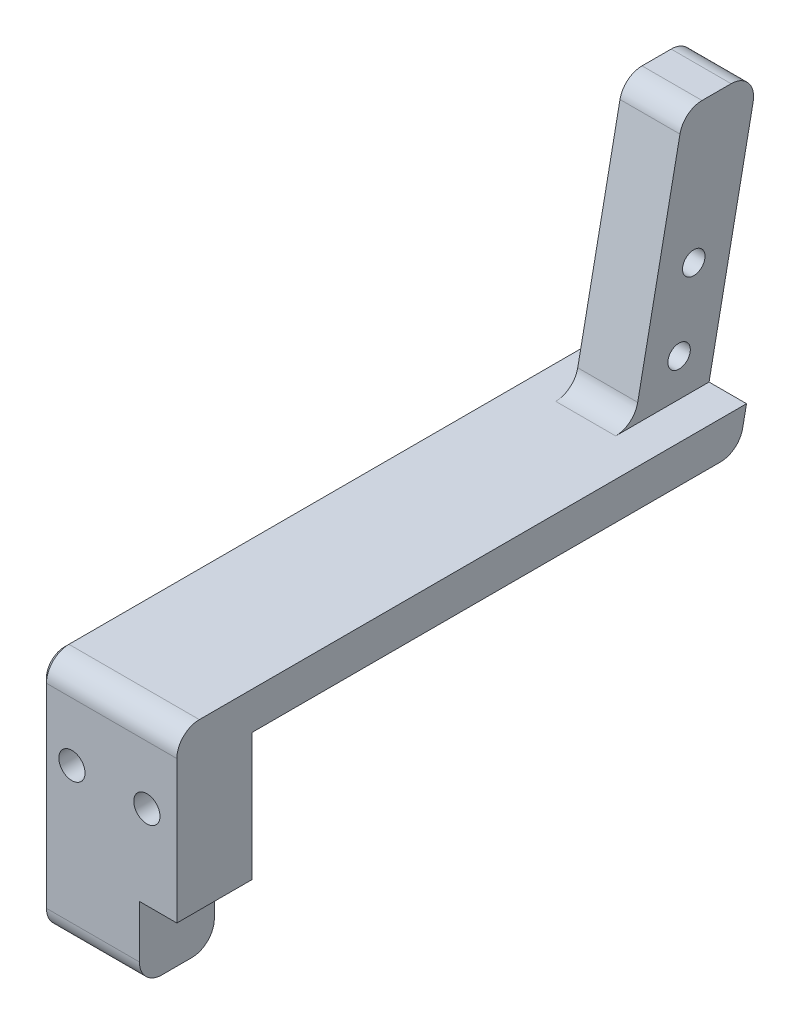
ISO-10303-21;
HEADER;
FILE_DESCRIPTION(('STEP AP214'),'2;1');
FILE_NAME('part.step','',(''),(''),'','','');
FILE_SCHEMA(('AUTOMOTIVE_DESIGN { 1 0 10303 214 1 1 1 1 }'));
ENDSEC;
DATA;
#1=APPLICATION_CONTEXT('core data for automotive mechanical design processes');
#2=APPLICATION_PROTOCOL_DEFINITION('international standard','automotive_design',2000,#1);
#3=PRODUCT_CONTEXT('',#1,'mechanical');
#4=PRODUCT('Part','Part','',(#3));
#5=PRODUCT_RELATED_PRODUCT_CATEGORY('part','',(#4));
#6=PRODUCT_DEFINITION_FORMATION('','',#4);
#7=PRODUCT_DEFINITION_CONTEXT('part definition',#1,'design');
#8=PRODUCT_DEFINITION('design','',#6,#7);
#9=PRODUCT_DEFINITION_SHAPE('','',#8);
#10=(LENGTH_UNIT() NAMED_UNIT(*) SI_UNIT(.MILLI.,.METRE.));
#11=(NAMED_UNIT(*) PLANE_ANGLE_UNIT() SI_UNIT($,.RADIAN.));
#12=(NAMED_UNIT(*) SI_UNIT($,.STERADIAN.) SOLID_ANGLE_UNIT());
#13=UNCERTAINTY_MEASURE_WITH_UNIT(LENGTH_MEASURE(1.E-05),#10,'distance_accuracy_value','');
#14=(GEOMETRIC_REPRESENTATION_CONTEXT(3) GLOBAL_UNCERTAINTY_ASSIGNED_CONTEXT((#13)) GLOBAL_UNIT_ASSIGNED_CONTEXT((#10,
#11,#12)) REPRESENTATION_CONTEXT('',''));
#15=CARTESIAN_POINT('',(0.,0.,0.));
#16=DIRECTION('',(0.,0.,1.));
#17=DIRECTION('',(1.,0.,0.));
#18=AXIS2_PLACEMENT_3D('',#15,#16,#17);
#19=CARTESIAN_POINT('',(-99.9217668900714,-11.3731402474737,-56.8653527400471));
#20=DIRECTION('',(0.,-0.196117290802064,-0.980580444557436));
#21=DIRECTION('',(0.,0.980580444557436,-0.196117290802064));
#22=AXIS2_PLACEMENT_3D('',#19,#20,#21);
#23=PLANE('',#22);
#24=DIRECTION('',(0.,-0.980580444557436,0.196117290802064));
#25=VECTOR('',#24,1.);
#26=CARTESIAN_POINT('',(4.,-11.3731402474737,-56.8653527400471));
#27=LINE('',#26,#25);
#28=CARTESIAN_POINT('',(4.,39.8883518724062,-67.1177139948746));
#29=VERTEX_POINT('',#28);
#30=CARTESIAN_POINT('',(4.,11.7116481275938,-61.4823387099239));
#31=VERTEX_POINT('',#30);
#32=EDGE_CURVE('E445',#29,#31,#27,.T.);
#33=ORIENTED_EDGE('',*,*,#32,.F.);
#34=DIRECTION('',(1.,0.,0.));
#35=VECTOR('',#34,1.);
#36=CARTESIAN_POINT('',(-99.9217668900714,39.8883518724062,-67.1177139948746));
#37=LINE('',#36,#35);
#38=CARTESIAN_POINT('',(-4.,39.8883518724062,-67.1177139948746));
#39=VERTEX_POINT('',#38);
#40=EDGE_CURVE('E318',#29,#39,#37,.F.);
#41=ORIENTED_EDGE('',*,*,#40,.T.);
#42=DIRECTION('',(0.,-0.980580444557436,0.196117290802064));
#43=VECTOR('',#42,1.);
#44=CARTESIAN_POINT('',(-4.,-11.3731402474737,-56.8653527400471));
#45=LINE('',#44,#43);
#46=CARTESIAN_POINT('',(-4.,11.7116481275938,-61.4823387099239));
#47=VERTEX_POINT('',#46);
#48=EDGE_CURVE('E454',#39,#47,#45,.T.);
#49=ORIENTED_EDGE('',*,*,#48,.T.);
#50=DIRECTION('',(1.,0.,0.));
#51=VECTOR('',#50,1.);
#52=CARTESIAN_POINT('',(4.,11.7116481275938,-61.4823387099239));
#53=LINE('',#52,#51);
#54=EDGE_CURVE('E314',#47,#31,#53,.T.);
#55=ORIENTED_EDGE('',*,*,#54,.T.);
#56=EDGE_LOOP('',(#33,#41,#49,#55));
#57=FACE_BOUND('',#56,.T.);
#58=ADVANCED_FACE('F43',(#57),#23,.F.);
#59=CARTESIAN_POINT('',(-99.9217668900714,42.2999999999999,0.));
#60=DIRECTION('',(0.,-1.,0.));
#61=DIRECTION('',(0.,0.,-1.));
#62=AXIS2_PLACEMENT_3D('',#59,#60,#61);
#63=PLANE('',#62);
#64=DIRECTION('',(0.,0.,-1.));
#65=VECTOR('',#64,1.);
#66=CARTESIAN_POINT('',(4.,42.2999999999999,0.));
#67=LINE('',#66,#65);
#68=CARTESIAN_POINT('',(4.,42.2999999999999,-70.0594553285469));
#69=VERTEX_POINT('',#68);
#70=CARTESIAN_POINT('',(4.,42.2999999999999,-73.9406304699623));
#71=VERTEX_POINT('',#70);
#72=EDGE_CURVE('E232',#69,#71,#67,.T.);
#73=ORIENTED_EDGE('',*,*,#72,.T.);
#74=DIRECTION('',(1.,0.,0.));
#75=VECTOR('',#74,1.);
#76=CARTESIAN_POINT('',(-99.9217668900714,42.3,-73.9406304699623));
#77=LINE('',#76,#75);
#78=CARTESIAN_POINT('',(-4.,42.2999999999999,-73.9406304699623));
#79=VERTEX_POINT('',#78);
#80=EDGE_CURVE('E305',#71,#79,#77,.F.);
#81=ORIENTED_EDGE('',*,*,#80,.T.);
#82=DIRECTION('',(0.,0.,-1.));
#83=VECTOR('',#82,1.);
#84=CARTESIAN_POINT('',(-4.,42.2999999999999,0.));
#85=LINE('',#84,#83);
#86=CARTESIAN_POINT('',(-4.,42.2999999999999,-70.0594553285469));
#87=VERTEX_POINT('',#86);
#88=EDGE_CURVE('E441',#87,#79,#85,.T.);
#89=ORIENTED_EDGE('',*,*,#88,.F.);
#90=DIRECTION('',(1.,0.,0.));
#91=VECTOR('',#90,1.);
#92=CARTESIAN_POINT('',(-99.9217668900714,42.3,-70.0594553285469));
#93=LINE('',#92,#91);
#94=EDGE_CURVE('E301',#87,#69,#93,.T.);
#95=ORIENTED_EDGE('',*,*,#94,.T.);
#96=EDGE_LOOP('',(#73,#81,#89,#95));
#97=FACE_BOUND('',#96,.T.);
#98=ADVANCED_FACE('F605',(#97),#63,.F.);
#99=CARTESIAN_POINT('',(-99.9217668900714,-13.2962280494745,-66.4807328225317));
#100=DIRECTION('',(0.,0.196117290802064,0.980580444557436));
#101=DIRECTION('',(0.,-0.980580444557436,0.196117290802064));
#102=AXIS2_PLACEMENT_3D('',#99,#100,#101);
#103=PLANE('',#102);
#104=DIRECTION('',(1.,0.,0.));
#105=VECTOR('',#104,1.);
#106=CARTESIAN_POINT('',(-99.9217668900714,6.7116481275938,-70.4823325814589));
#107=LINE('',#106,#105);
#108=CARTESIAN_POINT('',(9.,6.7116481275938,-70.4823325814589));
#109=VERTEX_POINT('',#108);
#110=CARTESIAN_POINT('',(-8.39999999999999,6.7116481275938,-70.4823325814589));
#111=VERTEX_POINT('',#110);
#112=EDGE_CURVE('E292',#109,#111,#107,.F.);
#113=ORIENTED_EDGE('',*,*,#112,.T.);
#114=DIRECTION('',(0.,0.980580444557436,-0.196117290802064));
#115=VECTOR('',#114,1.);
#116=CARTESIAN_POINT('',(-8.39999999999999,-13.2962280494745,-66.4807328225317));
#117=LINE('',#116,#115);
#118=CARTESIAN_POINT('',(-8.39999999999999,9.3,-71.0000061284649));
#119=VERTEX_POINT('',#118);
#120=EDGE_CURVE('E376',#111,#119,#117,.T.);
#121=ORIENTED_EDGE('',*,*,#120,.T.);
#122=DIRECTION('',(1.,0.,0.));
#123=VECTOR('',#122,1.);
#124=CARTESIAN_POINT('',(-99.9217668900714,9.3,-71.0000061284649));
#125=LINE('',#124,#123);
#126=CARTESIAN_POINT('',(-4.,9.3,-71.0000061284649));
#127=VERTEX_POINT('',#126);
#128=EDGE_CURVE('E241',#119,#127,#125,.T.);
#129=ORIENTED_EDGE('',*,*,#128,.T.);
#130=DIRECTION('',(0.,0.980580444557436,-0.196117290802064));
#131=VECTOR('',#130,1.);
#132=CARTESIAN_POINT('',(-4.,-13.2962280494745,-66.4807328225317));
#133=LINE('',#132,#131);
#134=CARTESIAN_POINT('',(-4.,38.7116481275938,-76.8823718036346));
#135=VERTEX_POINT('',#134);
#136=EDGE_CURVE('E244',#127,#135,#133,.T.);
#137=ORIENTED_EDGE('',*,*,#136,.T.);
#138=DIRECTION('',(1.,0.,0.));
#139=VECTOR('',#138,1.);
#140=CARTESIAN_POINT('',(-99.9217668900714,38.7116481275938,-76.8823718036346));
#141=LINE('',#140,#139);
#142=CARTESIAN_POINT('',(4.,38.7116481275938,-76.8823718036346));
#143=VERTEX_POINT('',#142);
#144=EDGE_CURVE('E239',#135,#143,#141,.T.);
#145=ORIENTED_EDGE('',*,*,#144,.T.);
#146=DIRECTION('',(0.,0.980580444557436,-0.196117290802064));
#147=VECTOR('',#146,1.);
#148=CARTESIAN_POINT('',(4.,-13.2962280494745,-66.4807328225317));
#149=LINE('',#148,#147);
#150=CARTESIAN_POINT('',(4.,9.3,-71.0000061284649));
#151=VERTEX_POINT('',#150);
#152=EDGE_CURVE('E221',#151,#143,#149,.T.);
#153=ORIENTED_EDGE('',*,*,#152,.F.);
#154=DIRECTION('',(1.,0.,0.));
#155=VECTOR('',#154,1.);
#156=CARTESIAN_POINT('',(-99.9217668900714,9.3,-71.0000061284649));
#157=LINE('',#156,#155);
#158=CARTESIAN_POINT('',(9.,9.3,-71.0000061284649));
#159=VERTEX_POINT('',#158);
#160=EDGE_CURVE('E207',#151,#159,#157,.T.);
#161=ORIENTED_EDGE('',*,*,#160,.T.);
#162=DIRECTION('',(0.,-0.980580444557436,0.196117290802064));
#163=VECTOR('',#162,1.);
#164=CARTESIAN_POINT('',(9.,-13.2962280494745,-66.4807328225317));
#165=LINE('',#164,#163);
#166=EDGE_CURVE('E464',#159,#109,#165,.T.);
#167=ORIENTED_EDGE('',*,*,#166,.T.);
#168=EDGE_LOOP('',(#113,#121,#129,#137,#145,#153,#161,#167));
#169=FACE_BOUND('',#168,.T.);
#170=ADVANCED_FACE('F236',(#169),#103,.F.);
#171=CARTESIAN_POINT('',(9.,0.,-5.));
#172=DIRECTION('',(0.,0.,1.));
#173=DIRECTION('',(1.,0.,0.));
#174=AXIS2_PLACEMENT_3D('',#171,#172,#173);
#175=PLANE('',#174);
#176=CARTESIAN_POINT('',(-5.,-1.5,-5.));
#177=DIRECTION('',(0.,0.,-1.));
#178=DIRECTION('',(-1.,0.,0.));
#179=AXIS2_PLACEMENT_3D('',#176,#177,#178);
#180=CIRCLE('',#179,1.75);
#181=CARTESIAN_POINT('',(-6.75,-1.5,-5.));
#182=VERTEX_POINT('',#181);
#183=EDGE_CURVE('E498',#182,#182,#180,.T.);
#184=ORIENTED_EDGE('',*,*,#183,.F.);
#185=EDGE_LOOP('',(#184));
#186=FACE_BOUND('',#185,.T.);
#187=CARTESIAN_POINT('',(5.,-1.5,-5.));
#188=DIRECTION('',(0.,0.,-1.));
#189=DIRECTION('',(-1.,0.,0.));
#190=AXIS2_PLACEMENT_3D('',#187,#188,#189);
#191=CIRCLE('',#190,1.75);
#192=CARTESIAN_POINT('',(3.25,-1.5,-5.));
#193=VERTEX_POINT('',#192);
#194=EDGE_CURVE('E492',#193,#193,#191,.F.);
#195=ORIENTED_EDGE('',*,*,#194,.T.);
#196=EDGE_LOOP('',(#195));
#197=FACE_BOUND('',#196,.T.);
#198=DIRECTION('',(1.,0.,0.));
#199=VECTOR('',#198,1.);
#200=CARTESIAN_POINT('',(9.,-19.7,-5.));
#201=LINE('',#200,#199);
#202=CARTESIAN_POINT('',(4.,-19.7,-5.));
#203=VERTEX_POINT('',#202);
#204=CARTESIAN_POINT('',(-8.4,-19.7,-5.));
#205=VERTEX_POINT('',#204);
#206=EDGE_CURVE('E277',#203,#205,#201,.F.);
#207=ORIENTED_EDGE('',*,*,#206,.T.);
#208=DIRECTION('',(0.,1.,0.));
#209=VECTOR('',#208,1.);
#210=CARTESIAN_POINT('',(-8.4,0.,-5.));
#211=LINE('',#210,#209);
#212=CARTESIAN_POINT('',(-8.40000000000002,4.3,-5.));
#213=VERTEX_POINT('',#212);
#214=EDGE_CURVE('E367',#205,#213,#211,.T.);
#215=ORIENTED_EDGE('',*,*,#214,.T.);
#216=DIRECTION('',(1.,0.,0.));
#217=VECTOR('',#216,1.);
#218=CARTESIAN_POINT('',(-99.9217668900714,4.3,-5.));
#219=LINE('',#218,#217);
#220=CARTESIAN_POINT('',(9.,4.3,-5.));
#221=VERTEX_POINT('',#220);
#222=EDGE_CURVE('E467',#213,#221,#219,.T.);
#223=ORIENTED_EDGE('',*,*,#222,.T.);
#224=DIRECTION('',(0.,1.,0.));
#225=VECTOR('',#224,1.);
#226=CARTESIAN_POINT('',(9.,0.,-5.));
#227=LINE('',#226,#225);
#228=CARTESIAN_POINT('',(9.,-12.7,-5.));
#229=VERTEX_POINT('',#228);
#230=EDGE_CURVE('E512',#229,#221,#227,.T.);
#231=ORIENTED_EDGE('',*,*,#230,.F.);
#232=DIRECTION('',(-1.,0.,0.));
#233=VECTOR('',#232,1.);
#234=CARTESIAN_POINT('',(9.00000000000001,-12.7,-5.));
#235=LINE('',#234,#233);
#236=CARTESIAN_POINT('',(4.,-12.7,-5.));
#237=VERTEX_POINT('',#236);
#238=EDGE_CURVE('E488',#229,#237,#235,.T.);
#239=ORIENTED_EDGE('',*,*,#238,.T.);
#240=DIRECTION('',(0.,-1.,0.));
#241=VECTOR('',#240,1.);
#242=CARTESIAN_POINT('',(4.,0.,-5.));
#243=LINE('',#242,#241);
#244=EDGE_CURVE('E482',#237,#203,#243,.T.);
#245=ORIENTED_EDGE('',*,*,#244,.T.);
#246=EDGE_LOOP('',(#207,#215,#223,#231,#239,#245));
#247=FACE_BOUND('',#246,.T.);
#248=ADVANCED_FACE('F573',(#186,#197,#247),#175,.F.);
#249=CARTESIAN_POINT('',(9.,0.,5.));
#250=DIRECTION('',(0.,0.,1.));
#251=DIRECTION('',(1.,0.,0.));
#252=AXIS2_PLACEMENT_3D('',#249,#250,#251);
#253=PLANE('',#252);
#254=DIRECTION('',(1.,0.,0.));
#255=VECTOR('',#254,1.);
#256=CARTESIAN_POINT('',(-8.99999999999999,6.3,5.));
#257=LINE('',#256,#255);
#258=CARTESIAN_POINT('',(9.,6.3,5.));
#259=VERTEX_POINT('',#258);
#260=CARTESIAN_POINT('',(-8.4,6.3,5.));
#261=VERTEX_POINT('',#260);
#262=EDGE_CURVE('E265',#259,#261,#257,.F.);
#263=ORIENTED_EDGE('',*,*,#262,.T.);
#264=DIRECTION('',(0.,-1.,0.));
#265=VECTOR('',#264,1.);
#266=CARTESIAN_POINT('',(-8.4,-19.7,5.));
#267=LINE('',#266,#265);
#268=CARTESIAN_POINT('',(-8.4,-19.7,5.));
#269=VERTEX_POINT('',#268);
#270=EDGE_CURVE('E69',#261,#269,#267,.T.);
#271=ORIENTED_EDGE('',*,*,#270,.T.);
#272=DIRECTION('',(-1.,0.,0.));
#273=VECTOR('',#272,1.);
#274=CARTESIAN_POINT('',(4.,-19.7,5.));
#275=LINE('',#274,#273);
#276=CARTESIAN_POINT('',(4.,-19.7,5.));
#277=VERTEX_POINT('',#276);
#278=EDGE_CURVE('E268',#269,#277,#275,.F.);
#279=ORIENTED_EDGE('',*,*,#278,.T.);
#280=DIRECTION('',(0.,-1.,0.));
#281=VECTOR('',#280,1.);
#282=CARTESIAN_POINT('',(4.,-22.7,5.));
#283=LINE('',#282,#281);
#284=CARTESIAN_POINT('',(4.,-12.7,5.));
#285=VERTEX_POINT('',#284);
#286=EDGE_CURVE('E474',#285,#277,#283,.T.);
#287=ORIENTED_EDGE('',*,*,#286,.F.);
#288=DIRECTION('',(-1.,0.,0.));
#289=VECTOR('',#288,1.);
#290=CARTESIAN_POINT('',(9.,-12.7,5.));
#291=LINE('',#290,#289);
#292=CARTESIAN_POINT('',(9.,-12.7,5.));
#293=VERTEX_POINT('',#292);
#294=EDGE_CURVE('E470',#293,#285,#291,.T.);
#295=ORIENTED_EDGE('',*,*,#294,.F.);
#296=DIRECTION('',(0.,1.,0.));
#297=VECTOR('',#296,1.);
#298=CARTESIAN_POINT('',(9.,0.,5.));
#299=LINE('',#298,#297);
#300=EDGE_CURVE('E497',#293,#259,#299,.T.);
#301=ORIENTED_EDGE('',*,*,#300,.T.);
#302=EDGE_LOOP('',(#263,#271,#279,#287,#295,#301));
#303=FACE_BOUND('',#302,.T.);
#304=CARTESIAN_POINT('',(5.,-1.5,5.));
#305=DIRECTION('',(0.,0.,-1.));
#306=DIRECTION('',(-1.,0.,0.));
#307=AXIS2_PLACEMENT_3D('',#304,#305,#306);
#308=CIRCLE('',#307,1.75);
#309=CARTESIAN_POINT('',(3.25,-1.5,5.));
#310=VERTEX_POINT('',#309);
#311=EDGE_CURVE('E502',#310,#310,#308,.F.);
#312=ORIENTED_EDGE('',*,*,#311,.F.);
#313=EDGE_LOOP('',(#312));
#314=FACE_BOUND('',#313,.T.);
#315=CARTESIAN_POINT('',(-5.,-1.5,5.));
#316=DIRECTION('',(0.,0.,-1.));
#317=DIRECTION('',(-1.,0.,0.));
#318=AXIS2_PLACEMENT_3D('',#315,#316,#317);
#319=CIRCLE('',#318,1.75);
#320=CARTESIAN_POINT('',(-6.75,-1.5,5.));
#321=VERTEX_POINT('',#320);
#322=EDGE_CURVE('E493',#321,#321,#319,.T.);
#323=ORIENTED_EDGE('',*,*,#322,.T.);
#324=EDGE_LOOP('',(#323));
#325=FACE_BOUND('',#324,.T.);
#326=ADVANCED_FACE('F531',(#303,#314,#325),#253,.T.);
#327=CARTESIAN_POINT('',(-9.,0.,0.));
#328=DIRECTION('',(1.,0.,0.));
#329=DIRECTION('',(0.,0.,-1.));
#330=AXIS2_PLACEMENT_3D('',#327,#328,#329);
#331=PLANE('',#330);
#332=DIRECTION('',(0.,-1.,0.));
#333=VECTOR('',#332,1.);
#334=CARTESIAN_POINT('',(-9.,0.,-4.4));
#335=LINE('',#334,#333);
#336=CARTESIAN_POINT('',(-9.,4.9,-4.4));
#337=VERTEX_POINT('',#336);
#338=CARTESIAN_POINT('',(-9.,-19.7,-4.4));
#339=VERTEX_POINT('',#338);
#340=EDGE_CURVE('E356',#337,#339,#335,.T.);
#341=ORIENTED_EDGE('',*,*,#340,.T.);
#342=CARTESIAN_POINT('',(-9.,-19.7,-2.));
#343=DIRECTION('',(1.,0.,0.));
#344=DIRECTION('',(0.,0.,-1.));
#345=AXIS2_PLACEMENT_3D('',#342,#343,#344);
#346=CIRCLE('',#345,2.4);
#347=CARTESIAN_POINT('',(-9.,-22.1,-2.));
#348=VERTEX_POINT('',#347);
#349=EDGE_CURVE('E359',#339,#348,#346,.F.);
#350=ORIENTED_EDGE('',*,*,#349,.T.);
#351=DIRECTION('',(0.,0.,1.));
#352=VECTOR('',#351,1.);
#353=CARTESIAN_POINT('',(-9.,-22.1,0.));
#354=LINE('',#353,#352);
#355=CARTESIAN_POINT('',(-9.,-22.1,2.));
#356=VERTEX_POINT('',#355);
#357=EDGE_CURVE('E332',#348,#356,#354,.T.);
#358=ORIENTED_EDGE('',*,*,#357,.T.);
#359=CARTESIAN_POINT('',(-9.,-19.7,2.));
#360=DIRECTION('',(1.,0.,0.));
#361=DIRECTION('',(0.,0.,-1.));
#362=AXIS2_PLACEMENT_3D('',#359,#360,#361);
#363=CIRCLE('',#362,2.4);
#364=CARTESIAN_POINT('',(-9.,-19.7,4.4));
#365=VERTEX_POINT('',#364);
#366=EDGE_CURVE('E335',#356,#365,#363,.F.);
#367=ORIENTED_EDGE('',*,*,#366,.T.);
#368=DIRECTION('',(0.,1.,0.));
#369=VECTOR('',#368,1.);
#370=CARTESIAN_POINT('',(-9.,6.3,4.4));
#371=LINE('',#370,#369);
#372=CARTESIAN_POINT('',(-9.,6.3,4.4));
#373=VERTEX_POINT('',#372);
#374=EDGE_CURVE('E338',#365,#373,#371,.T.);
#375=ORIENTED_EDGE('',*,*,#374,.T.);
#376=CARTESIAN_POINT('',(-9.,6.3,2.));
#377=DIRECTION('',(1.,0.,0.));
#378=DIRECTION('',(0.,0.,-1.));
#379=AXIS2_PLACEMENT_3D('',#376,#377,#378);
#380=CIRCLE('',#379,2.39999999999999);
#381=CARTESIAN_POINT('',(-9.,8.69999999999999,2.));
#382=VERTEX_POINT('',#381);
#383=EDGE_CURVE('E341',#373,#382,#380,.F.);
#384=ORIENTED_EDGE('',*,*,#383,.T.);
#385=DIRECTION('',(0.,0.,-1.));
#386=VECTOR('',#385,1.);
#387=CARTESIAN_POINT('',(-9.,8.7,0.));
#388=LINE('',#387,#386);
#389=CARTESIAN_POINT('',(-9.,8.7,-70.2681229071907));
#390=VERTEX_POINT('',#389);
#391=EDGE_CURVE('E344',#382,#390,#388,.T.);
#392=ORIENTED_EDGE('',*,*,#391,.T.);
#393=DIRECTION('',(0.,-0.980580444557436,0.196117290802064));
#394=VECTOR('',#393,1.);
#395=CARTESIAN_POINT('',(-9.,-13.1785576749933,-65.8923845557972));
#396=LINE('',#395,#394);
#397=CARTESIAN_POINT('',(-9.,6.82931850207504,-69.8939843147245));
#398=VERTEX_POINT('',#397);
#399=EDGE_CURVE('E347',#390,#398,#396,.T.);
#400=ORIENTED_EDGE('',*,*,#399,.T.);
#401=CARTESIAN_POINT('',(-9.,7.3,-67.5405912477866));
#402=DIRECTION('',(1.,0.,0.));
#403=DIRECTION('',(0.,0.,-1.));
#404=AXIS2_PLACEMENT_3D('',#401,#402,#403);
#405=CIRCLE('',#404,2.39999999999999);
#406=CARTESIAN_POINT('',(-9.,4.90000000000001,-67.5405912477866));
#407=VERTEX_POINT('',#406);
#408=EDGE_CURVE('E350',#398,#407,#405,.F.);
#409=ORIENTED_EDGE('',*,*,#408,.T.);
#410=DIRECTION('',(0.,0.,1.));
#411=VECTOR('',#410,1.);
#412=CARTESIAN_POINT('',(-9.,4.9,0.));
#413=LINE('',#412,#411);
#414=EDGE_CURVE('E353',#407,#337,#413,.T.);
#415=ORIENTED_EDGE('',*,*,#414,.T.);
#416=EDGE_LOOP('',(#341,#350,#358,#367,#375,#384,#392,#400,#409,#415));
#417=FACE_BOUND('',#416,.T.);
#418=ADVANCED_FACE('F593',(#417),#331,.F.);
#419=CARTESIAN_POINT('',(9.,0.,0.));
#420=DIRECTION('',(1.,0.,0.));
#421=DIRECTION('',(0.,0.,-1.));
#422=AXIS2_PLACEMENT_3D('',#419,#420,#421);
#423=PLANE('',#422);
#424=DIRECTION('',(0.,0.,1.));
#425=VECTOR('',#424,1.);
#426=CARTESIAN_POINT('',(9.,4.29999999999999,0.));
#427=LINE('',#426,#425);
#428=CARTESIAN_POINT('',(9.,4.3,-67.5405912477866));
#429=VERTEX_POINT('',#428);
#430=EDGE_CURVE('E460',#429,#221,#427,.T.);
#431=ORIENTED_EDGE('',*,*,#430,.F.);
#432=CARTESIAN_POINT('',(8.99999999999999,7.3,-67.5405912477866));
#433=DIRECTION('',(1.,0.,0.));
#434=DIRECTION('',(0.,0.,-1.));
#435=AXIS2_PLACEMENT_3D('',#432,#433,#434);
#436=CIRCLE('',#435,3.);
#437=EDGE_CURVE('E287',#429,#109,#436,.T.);
#438=ORIENTED_EDGE('',*,*,#437,.T.);
#439=ORIENTED_EDGE('',*,*,#166,.F.);
#440=DIRECTION('',(0.,0.,-1.));
#441=VECTOR('',#440,1.);
#442=CARTESIAN_POINT('',(9.,9.3,0.));
#443=LINE('',#442,#441);
#444=CARTESIAN_POINT('',(9.,9.3,2.));
#445=VERTEX_POINT('',#444);
#446=EDGE_CURVE('E215',#445,#159,#443,.T.);
#447=ORIENTED_EDGE('',*,*,#446,.F.);
#448=CARTESIAN_POINT('',(8.99999999999999,6.3,2.));
#449=DIRECTION('',(1.,0.,0.));
#450=DIRECTION('',(0.,0.,-1.));
#451=AXIS2_PLACEMENT_3D('',#448,#449,#450);
#452=CIRCLE('',#451,3.);
#453=EDGE_CURVE('E284',#445,#259,#452,.T.);
#454=ORIENTED_EDGE('',*,*,#453,.T.);
#455=ORIENTED_EDGE('',*,*,#300,.F.);
#456=DIRECTION('',(0.,0.,1.));
#457=VECTOR('',#456,1.);
#458=CARTESIAN_POINT('',(9.,-12.7,-12.1590237649112));
#459=LINE('',#458,#457);
#460=EDGE_CURVE('E478',#229,#293,#459,.T.);
#461=ORIENTED_EDGE('',*,*,#460,.F.);
#462=ORIENTED_EDGE('',*,*,#230,.T.);
#463=EDGE_LOOP('',(#431,#438,#439,#447,#454,#455,#461,#462));
#464=FACE_BOUND('',#463,.T.);
#465=ADVANCED_FACE('F539',(#464),#423,.T.);
#466=CARTESIAN_POINT('',(5.,-1.5,5.));
#467=DIRECTION('',(0.,0.,-1.));
#468=DIRECTION('',(-1.,0.,0.));
#469=AXIS2_PLACEMENT_3D('',#466,#467,#468);
#470=CYLINDRICAL_SURFACE('',#469,1.75);
#471=ORIENTED_EDGE('',*,*,#311,.T.);
#472=EDGE_LOOP('',(#471));
#473=FACE_BOUND('',#472,.T.);
#474=ORIENTED_EDGE('',*,*,#194,.F.);
#475=EDGE_LOOP('',(#474));
#476=FACE_BOUND('',#475,.T.);
#477=ADVANCED_FACE('F656',(#473,#476),#470,.F.);
#478=CARTESIAN_POINT('',(-5.,-1.5,5.));
#479=DIRECTION('',(0.,0.,-1.));
#480=DIRECTION('',(-1.,0.,0.));
#481=AXIS2_PLACEMENT_3D('',#478,#479,#480);
#482=CYLINDRICAL_SURFACE('',#481,1.75);
#483=ORIENTED_EDGE('',*,*,#322,.F.);
#484=EDGE_LOOP('',(#483));
#485=FACE_BOUND('',#484,.T.);
#486=ORIENTED_EDGE('',*,*,#183,.T.);
#487=EDGE_LOOP('',(#486));
#488=FACE_BOUND('',#487,.T.);
#489=ADVANCED_FACE('F653',(#485,#488),#482,.F.);
#490=CARTESIAN_POINT('',(0.,-22.7,0.));
#491=DIRECTION('',(0.,1.,0.));
#492=DIRECTION('',(0.,0.,1.));
#493=AXIS2_PLACEMENT_3D('',#490,#491,#492);
#494=PLANE('',#493);
#495=DIRECTION('',(-1.,0.,0.));
#496=VECTOR('',#495,1.);
#497=CARTESIAN_POINT('',(-9.,-22.7,2.));
#498=LINE('',#497,#496);
#499=CARTESIAN_POINT('',(4.,-22.7,2.));
#500=VERTEX_POINT('',#499);
#501=CARTESIAN_POINT('',(-8.4,-22.7,2.));
#502=VERTEX_POINT('',#501);
#503=EDGE_CURVE('E262',#500,#502,#498,.T.);
#504=ORIENTED_EDGE('',*,*,#503,.T.);
#505=DIRECTION('',(0.,0.,-1.));
#506=VECTOR('',#505,1.);
#507=CARTESIAN_POINT('',(-8.4,-22.7,0.));
#508=LINE('',#507,#506);
#509=CARTESIAN_POINT('',(-8.4,-22.7,-2.));
#510=VERTEX_POINT('',#509);
#511=EDGE_CURVE('E11',#502,#510,#508,.T.);
#512=ORIENTED_EDGE('',*,*,#511,.T.);
#513=DIRECTION('',(1.,0.,0.));
#514=VECTOR('',#513,1.);
#515=CARTESIAN_POINT('',(0.,-22.7,-2.));
#516=LINE('',#515,#514);
#517=CARTESIAN_POINT('',(4.,-22.7,-2.));
#518=VERTEX_POINT('',#517);
#519=EDGE_CURVE('E250',#510,#518,#516,.T.);
#520=ORIENTED_EDGE('',*,*,#519,.T.);
#521=DIRECTION('',(0.,0.,1.));
#522=VECTOR('',#521,1.);
#523=CARTESIAN_POINT('',(4.,-22.7,0.));
#524=LINE('',#523,#522);
#525=EDGE_CURVE('E222',#518,#500,#524,.T.);
#526=ORIENTED_EDGE('',*,*,#525,.T.);
#527=EDGE_LOOP('',(#504,#512,#520,#526));
#528=FACE_BOUND('',#527,.T.);
#529=ADVANCED_FACE('F519',(#528),#494,.F.);
#530=CARTESIAN_POINT('',(9.,-12.7,-12.1590237649112));
#531=DIRECTION('',(0.,1.,0.));
#532=DIRECTION('',(-1.,0.,0.));
#533=AXIS2_PLACEMENT_3D('',#530,#531,#532);
#534=PLANE('',#533);
#535=ORIENTED_EDGE('',*,*,#460,.T.);
#536=ORIENTED_EDGE('',*,*,#294,.T.);
#537=DIRECTION('',(0.,0.,1.));
#538=VECTOR('',#537,1.);
#539=CARTESIAN_POINT('',(4.,-12.7,-12.1590237649112));
#540=LINE('',#539,#538);
#541=EDGE_CURVE('E479',#237,#285,#540,.T.);
#542=ORIENTED_EDGE('',*,*,#541,.F.);
#543=ORIENTED_EDGE('',*,*,#238,.F.);
#544=EDGE_LOOP('',(#535,#536,#542,#543));
#545=FACE_BOUND('',#544,.T.);
#546=ADVANCED_FACE('F648',(#545),#534,.F.);
#547=CARTESIAN_POINT('',(4.,-22.7,-12.1590237649112));
#548=DIRECTION('',(-1.,0.,0.));
#549=DIRECTION('',(0.,0.,1.));
#550=AXIS2_PLACEMENT_3D('',#547,#548,#549);
#551=PLANE('',#550);
#552=ORIENTED_EDGE('',*,*,#286,.T.);
#553=CARTESIAN_POINT('',(4.,-19.7,2.));
#554=DIRECTION('',(-1.,0.,0.));
#555=DIRECTION('',(0.,0.,1.));
#556=AXIS2_PLACEMENT_3D('',#553,#554,#555);
#557=CIRCLE('',#556,3.);
#558=EDGE_CURVE('E274',#277,#500,#557,.F.);
#559=ORIENTED_EDGE('',*,*,#558,.T.);
#560=ORIENTED_EDGE('',*,*,#525,.F.);
#561=CARTESIAN_POINT('',(4.,-19.7,-2.));
#562=DIRECTION('',(-1.,0.,0.));
#563=DIRECTION('',(0.,0.,1.));
#564=AXIS2_PLACEMENT_3D('',#561,#562,#563);
#565=CIRCLE('',#564,3.);
#566=EDGE_CURVE('E271',#518,#203,#565,.F.);
#567=ORIENTED_EDGE('',*,*,#566,.T.);
#568=ORIENTED_EDGE('',*,*,#244,.F.);
#569=ORIENTED_EDGE('',*,*,#541,.T.);
#570=EDGE_LOOP('',(#552,#559,#560,#567,#568,#569));
#571=FACE_BOUND('',#570,.T.);
#572=ADVANCED_FACE('F527',(#571),#551,.F.);
#573=CARTESIAN_POINT('',(-99.9217668900714,9.3,0.));
#574=DIRECTION('',(0.,-1.,0.));
#575=DIRECTION('',(0.,0.,-1.));
#576=AXIS2_PLACEMENT_3D('',#573,#574,#575);
#577=PLANE('',#576);
#578=ORIENTED_EDGE('',*,*,#128,.F.);
#579=DIRECTION('',(0.,0.,1.));
#580=VECTOR('',#579,1.);
#581=CARTESIAN_POINT('',(-8.39999999999999,9.3,0.));
#582=LINE('',#581,#580);
#583=CARTESIAN_POINT('',(-8.39999999999999,9.3,2.));
#584=VERTEX_POINT('',#583);
#585=EDGE_CURVE('E379',#119,#584,#582,.T.);
#586=ORIENTED_EDGE('',*,*,#585,.T.);
#587=DIRECTION('',(1.,0.,0.));
#588=VECTOR('',#587,1.);
#589=CARTESIAN_POINT('',(8.99999999999999,9.3,2.));
#590=LINE('',#589,#588);
#591=EDGE_CURVE('E321',#584,#445,#590,.T.);
#592=ORIENTED_EDGE('',*,*,#591,.T.);
#593=ORIENTED_EDGE('',*,*,#446,.T.);
#594=ORIENTED_EDGE('',*,*,#160,.F.);
#595=DIRECTION('',(0.,0.,-1.));
#596=VECTOR('',#595,1.);
#597=CARTESIAN_POINT('',(4.,9.3,0.));
#598=LINE('',#597,#596);
#599=CARTESIAN_POINT('',(4.,9.3,-58.5405973762516));
#600=VERTEX_POINT('',#599);
#601=EDGE_CURVE('E212',#600,#151,#598,.T.);
#602=ORIENTED_EDGE('',*,*,#601,.F.);
#603=DIRECTION('',(1.,0.,0.));
#604=VECTOR('',#603,1.);
#605=CARTESIAN_POINT('',(-4.,9.3,-58.5405973762516));
#606=LINE('',#605,#604);
#607=CARTESIAN_POINT('',(-4.,9.3,-58.5405973762516));
#608=VERTEX_POINT('',#607);
#609=EDGE_CURVE('E324',#600,#608,#606,.F.);
#610=ORIENTED_EDGE('',*,*,#609,.T.);
#611=DIRECTION('',(0.,0.,-1.));
#612=VECTOR('',#611,1.);
#613=CARTESIAN_POINT('',(-4.,9.3,0.));
#614=LINE('',#613,#612);
#615=EDGE_CURVE('E231',#608,#127,#614,.T.);
#616=ORIENTED_EDGE('',*,*,#615,.T.);
#617=EDGE_LOOP('',(#578,#586,#592,#593,#594,#602,#610,#616));
#618=FACE_BOUND('',#617,.T.);
#619=ADVANCED_FACE('F210',(#618),#577,.F.);
#620=CARTESIAN_POINT('',(-99.9217668900714,4.29999999999999,0.));
#621=DIRECTION('',(0.,1.,0.));
#622=DIRECTION('',(0.,0.,1.));
#623=AXIS2_PLACEMENT_3D('',#620,#621,#622);
#624=PLANE('',#623);
#625=ORIENTED_EDGE('',*,*,#222,.F.);
#626=DIRECTION('',(0.,0.,-1.));
#627=VECTOR('',#626,1.);
#628=CARTESIAN_POINT('',(-8.39999999999999,4.29999999999999,0.));
#629=LINE('',#628,#627);
#630=CARTESIAN_POINT('',(-8.39999999999999,4.3,-67.5405912477866));
#631=VERTEX_POINT('',#630);
#632=EDGE_CURVE('E370',#213,#631,#629,.T.);
#633=ORIENTED_EDGE('',*,*,#632,.T.);
#634=DIRECTION('',(1.,0.,0.));
#635=VECTOR('',#634,1.);
#636=CARTESIAN_POINT('',(-99.9217668900714,4.3,-67.5405912477866));
#637=LINE('',#636,#635);
#638=EDGE_CURVE('E281',#631,#429,#637,.T.);
#639=ORIENTED_EDGE('',*,*,#638,.T.);
#640=ORIENTED_EDGE('',*,*,#430,.T.);
#641=EDGE_LOOP('',(#625,#633,#639,#640));
#642=FACE_BOUND('',#641,.T.);
#643=ADVANCED_FACE('F576',(#642),#624,.F.);
#644=CARTESIAN_POINT('',(4.,-9.96036096916027,0.));
#645=DIRECTION('',(1.,0.,0.));
#646=DIRECTION('',(0.,0.,-1.));
#647=AXIS2_PLACEMENT_3D('',#644,#645,#646);
#648=PLANE('',#647);
#649=CARTESIAN_POINT('',(4.,24.1058044455744,-68.9611851649505));
#650=DIRECTION('',(1.,0.,0.));
#651=DIRECTION('',(0.,0.,-1.));
#652=AXIS2_PLACEMENT_3D('',#649,#650,#651);
#653=CIRCLE('',#652,1.5);
#654=CARTESIAN_POINT('',(4.,24.1058044455744,-70.4611851649505));
#655=VERTEX_POINT('',#654);
#656=EDGE_CURVE('E256',#655,#655,#653,.T.);
#657=ORIENTED_EDGE('',*,*,#656,.F.);
#658=EDGE_LOOP('',(#657));
#659=FACE_BOUND('',#658,.T.);
#660=CARTESIAN_POINT('',(4.,14.3,-67.0000122569299));
#661=DIRECTION('',(1.,0.,0.));
#662=DIRECTION('',(0.,0.,-1.));
#663=AXIS2_PLACEMENT_3D('',#660,#661,#662);
#664=CIRCLE('',#663,1.5);
#665=CARTESIAN_POINT('',(4.,14.3,-68.5000122569299));
#666=VERTEX_POINT('',#665);
#667=EDGE_CURVE('E427',#666,#666,#664,.T.);
#668=ORIENTED_EDGE('',*,*,#667,.F.);
#669=EDGE_LOOP('',(#668));
#670=FACE_BOUND('',#669,.T.);
#671=ORIENTED_EDGE('',*,*,#152,.T.);
#672=CARTESIAN_POINT('',(4.,39.3,-73.9406304699623));
#673=DIRECTION('',(1.,0.,0.));
#674=DIRECTION('',(0.,0.,-1.));
#675=AXIS2_PLACEMENT_3D('',#672,#673,#674);
#676=CIRCLE('',#675,3.);
#677=EDGE_CURVE('E298',#143,#71,#676,.T.);
#678=ORIENTED_EDGE('',*,*,#677,.T.);
#679=ORIENTED_EDGE('',*,*,#72,.F.);
#680=CARTESIAN_POINT('',(4.,39.3,-70.0594553285469));
#681=DIRECTION('',(1.,0.,0.));
#682=DIRECTION('',(0.,0.,-1.));
#683=AXIS2_PLACEMENT_3D('',#680,#681,#682);
#684=CIRCLE('',#683,3.);
#685=EDGE_CURVE('E295',#69,#29,#684,.T.);
#686=ORIENTED_EDGE('',*,*,#685,.T.);
#687=ORIENTED_EDGE('',*,*,#32,.T.);
#688=CARTESIAN_POINT('',(4.,12.3,-58.5405973762516));
#689=DIRECTION('',(1.,0.,0.));
#690=DIRECTION('',(0.,0.,-1.));
#691=AXIS2_PLACEMENT_3D('',#688,#689,#690);
#692=CIRCLE('',#691,3.);
#693=EDGE_CURVE('E228',#31,#600,#692,.F.);
#694=ORIENTED_EDGE('',*,*,#693,.T.);
#695=ORIENTED_EDGE('',*,*,#601,.T.);
#696=EDGE_LOOP('',(#671,#678,#679,#686,#687,#694,#695));
#697=FACE_BOUND('',#696,.T.);
#698=ADVANCED_FACE('F226',(#659,#670,#697),#648,.T.);
#699=CARTESIAN_POINT('',(-4.,-9.96036096916027,0.));
#700=DIRECTION('',(1.,0.,0.));
#701=DIRECTION('',(0.,0.,-1.));
#702=AXIS2_PLACEMENT_3D('',#699,#700,#701);
#703=PLANE('',#702);
#704=CARTESIAN_POINT('',(-4.,24.1058044455744,-68.9611851649505));
#705=DIRECTION('',(1.,0.,0.));
#706=DIRECTION('',(0.,0.,-1.));
#707=AXIS2_PLACEMENT_3D('',#704,#705,#706);
#708=CIRCLE('',#707,1.5);
#709=CARTESIAN_POINT('',(-4.,24.1058044455744,-70.4611851649505));
#710=VERTEX_POINT('',#709);
#711=EDGE_CURVE('E255',#710,#710,#708,.T.);
#712=ORIENTED_EDGE('',*,*,#711,.T.);
#713=EDGE_LOOP('',(#712));
#714=FACE_BOUND('',#713,.T.);
#715=CARTESIAN_POINT('',(-4.,14.3,-67.0000122569299));
#716=DIRECTION('',(1.,0.,0.));
#717=DIRECTION('',(0.,0.,-1.));
#718=AXIS2_PLACEMENT_3D('',#715,#716,#717);
#719=CIRCLE('',#718,1.5);
#720=CARTESIAN_POINT('',(-4.,14.3,-68.5000122569299));
#721=VERTEX_POINT('',#720);
#722=EDGE_CURVE('E251',#721,#721,#719,.T.);
#723=ORIENTED_EDGE('',*,*,#722,.T.);
#724=EDGE_LOOP('',(#723));
#725=FACE_BOUND('',#724,.T.);
#726=ORIENTED_EDGE('',*,*,#88,.T.);
#727=CARTESIAN_POINT('',(-4.,39.3,-73.9406304699623));
#728=DIRECTION('',(1.,0.,0.));
#729=DIRECTION('',(0.,0.,-1.));
#730=AXIS2_PLACEMENT_3D('',#727,#728,#729);
#731=CIRCLE('',#730,3.);
#732=EDGE_CURVE('E311',#79,#135,#731,.F.);
#733=ORIENTED_EDGE('',*,*,#732,.T.);
#734=ORIENTED_EDGE('',*,*,#136,.F.);
#735=ORIENTED_EDGE('',*,*,#615,.F.);
#736=CARTESIAN_POINT('',(-4.,12.3,-58.5405973762516));
#737=DIRECTION('',(1.,0.,0.));
#738=DIRECTION('',(0.,0.,-1.));
#739=AXIS2_PLACEMENT_3D('',#736,#737,#738);
#740=CIRCLE('',#739,3.);
#741=EDGE_CURVE('E329',#608,#47,#740,.T.);
#742=ORIENTED_EDGE('',*,*,#741,.T.);
#743=ORIENTED_EDGE('',*,*,#48,.F.);
#744=CARTESIAN_POINT('',(-4.,39.3,-70.0594553285469));
#745=DIRECTION('',(1.,0.,0.));
#746=DIRECTION('',(0.,0.,-1.));
#747=AXIS2_PLACEMENT_3D('',#744,#745,#746);
#748=CIRCLE('',#747,3.);
#749=EDGE_CURVE('E308',#39,#87,#748,.F.);
#750=ORIENTED_EDGE('',*,*,#749,.T.);
#751=EDGE_LOOP('',(#726,#733,#734,#735,#742,#743,#750));
#752=FACE_BOUND('',#751,.T.);
#753=ADVANCED_FACE('F619',(#714,#725,#752),#703,.F.);
#754=CARTESIAN_POINT('',(-9.00000000000002,14.3,-67.0000122569299));
#755=DIRECTION('',(1.,0.,0.));
#756=DIRECTION('',(0.,0.,-1.));
#757=AXIS2_PLACEMENT_3D('',#754,#755,#756);
#758=CYLINDRICAL_SURFACE('',#757,1.5);
#759=ORIENTED_EDGE('',*,*,#667,.T.);
#760=EDGE_LOOP('',(#759));
#761=FACE_BOUND('',#760,.T.);
#762=ORIENTED_EDGE('',*,*,#722,.F.);
#763=EDGE_LOOP('',(#762));
#764=FACE_BOUND('',#763,.T.);
#765=ADVANCED_FACE('F621',(#761,#764),#758,.F.);
#766=CARTESIAN_POINT('',(-9.00000000000002,24.1058044455744,-68.9611851649505));
#767=DIRECTION('',(1.,0.,0.));
#768=DIRECTION('',(0.,0.,-1.));
#769=AXIS2_PLACEMENT_3D('',#766,#767,#768);
#770=CYLINDRICAL_SURFACE('',#769,1.5);
#771=ORIENTED_EDGE('',*,*,#656,.T.);
#772=EDGE_LOOP('',(#771));
#773=FACE_BOUND('',#772,.T.);
#774=ORIENTED_EDGE('',*,*,#711,.F.);
#775=EDGE_LOOP('',(#774));
#776=FACE_BOUND('',#775,.T.);
#777=ADVANCED_FACE('F628',(#773,#776),#770,.F.);
#778=CARTESIAN_POINT('',(0.,-19.7,2.));
#779=DIRECTION('',(1.,0.,0.));
#780=DIRECTION('',(0.,0.,-1.));
#781=AXIS2_PLACEMENT_3D('',#778,#779,#780);
#782=CYLINDRICAL_SURFACE('',#781,3.);
#783=ORIENTED_EDGE('',*,*,#278,.F.);
#784=CARTESIAN_POINT('',(-8.4,-19.7,2.));
#785=DIRECTION('',(1.,0.,0.));
#786=DIRECTION('',(0.,0.,-1.));
#787=AXIS2_PLACEMENT_3D('',#784,#785,#786);
#788=CIRCLE('',#787,3.);
#789=EDGE_CURVE('E54',#269,#502,#788,.T.);
#790=ORIENTED_EDGE('',*,*,#789,.T.);
#791=ORIENTED_EDGE('',*,*,#503,.F.);
#792=ORIENTED_EDGE('',*,*,#558,.F.);
#793=EDGE_LOOP('',(#783,#790,#791,#792));
#794=FACE_BOUND('',#793,.T.);
#795=ADVANCED_FACE('F525',(#794),#782,.T.);
#796=CARTESIAN_POINT('',(0.,-19.7,-2.));
#797=DIRECTION('',(1.,0.,0.));
#798=DIRECTION('',(0.,0.,-1.));
#799=AXIS2_PLACEMENT_3D('',#796,#797,#798);
#800=CYLINDRICAL_SURFACE('',#799,3.);
#801=ORIENTED_EDGE('',*,*,#519,.F.);
#802=CARTESIAN_POINT('',(-8.4,-19.7,-2.));
#803=DIRECTION('',(1.,0.,0.));
#804=DIRECTION('',(0.,0.,-1.));
#805=AXIS2_PLACEMENT_3D('',#802,#803,#804);
#806=CIRCLE('',#805,3.);
#807=EDGE_CURVE('E363',#510,#205,#806,.T.);
#808=ORIENTED_EDGE('',*,*,#807,.T.);
#809=ORIENTED_EDGE('',*,*,#206,.F.);
#810=ORIENTED_EDGE('',*,*,#566,.F.);
#811=EDGE_LOOP('',(#801,#808,#809,#810));
#812=FACE_BOUND('',#811,.T.);
#813=ADVANCED_FACE('F560',(#812),#800,.T.);
#814=CARTESIAN_POINT('',(-99.9217668900714,7.3,-67.5405912477866));
#815=DIRECTION('',(1.,0.,0.));
#816=DIRECTION('',(0.,0.,-1.));
#817=AXIS2_PLACEMENT_3D('',#814,#815,#816);
#818=CYLINDRICAL_SURFACE('',#817,3.);
#819=ORIENTED_EDGE('',*,*,#638,.F.);
#820=CARTESIAN_POINT('',(-8.39999999999999,7.3,-67.5405912477866));
#821=DIRECTION('',(1.,0.,0.));
#822=DIRECTION('',(0.,0.,-1.));
#823=AXIS2_PLACEMENT_3D('',#820,#821,#822);
#824=CIRCLE('',#823,3.);
#825=EDGE_CURVE('E373',#631,#111,#824,.T.);
#826=ORIENTED_EDGE('',*,*,#825,.T.);
#827=ORIENTED_EDGE('',*,*,#112,.F.);
#828=ORIENTED_EDGE('',*,*,#437,.F.);
#829=EDGE_LOOP('',(#819,#826,#827,#828));
#830=FACE_BOUND('',#829,.T.);
#831=ADVANCED_FACE('F589',(#830),#818,.T.);
#832=CARTESIAN_POINT('',(-99.9217668900714,39.3,-73.9406304699623));
#833=DIRECTION('',(1.,0.,0.));
#834=DIRECTION('',(0.,0.,-1.));
#835=AXIS2_PLACEMENT_3D('',#832,#833,#834);
#836=CYLINDRICAL_SURFACE('',#835,3.);
#837=ORIENTED_EDGE('',*,*,#732,.F.);
#838=ORIENTED_EDGE('',*,*,#80,.F.);
#839=ORIENTED_EDGE('',*,*,#677,.F.);
#840=ORIENTED_EDGE('',*,*,#144,.F.);
#841=EDGE_LOOP('',(#837,#838,#839,#840));
#842=FACE_BOUND('',#841,.T.);
#843=ADVANCED_FACE('F601',(#842),#836,.T.);
#844=CARTESIAN_POINT('',(-99.9217668900714,39.3,-70.0594553285469));
#845=DIRECTION('',(1.,0.,0.));
#846=DIRECTION('',(0.,0.,-1.));
#847=AXIS2_PLACEMENT_3D('',#844,#845,#846);
#848=CYLINDRICAL_SURFACE('',#847,3.);
#849=ORIENTED_EDGE('',*,*,#749,.F.);
#850=ORIENTED_EDGE('',*,*,#40,.F.);
#851=ORIENTED_EDGE('',*,*,#685,.F.);
#852=ORIENTED_EDGE('',*,*,#94,.F.);
#853=EDGE_LOOP('',(#849,#850,#851,#852));
#854=FACE_BOUND('',#853,.T.);
#855=ADVANCED_FACE('F610',(#854),#848,.T.);
#856=CARTESIAN_POINT('',(-99.9217668900714,12.3,-58.5405973762516));
#857=DIRECTION('',(-1.,0.,0.));
#858=DIRECTION('',(0.,0.,1.));
#859=AXIS2_PLACEMENT_3D('',#856,#857,#858);
#860=CYLINDRICAL_SURFACE('',#859,3.);
#861=ORIENTED_EDGE('',*,*,#741,.F.);
#862=ORIENTED_EDGE('',*,*,#609,.F.);
#863=ORIENTED_EDGE('',*,*,#693,.F.);
#864=ORIENTED_EDGE('',*,*,#54,.F.);
#865=EDGE_LOOP('',(#861,#862,#863,#864));
#866=FACE_BOUND('',#865,.T.);
#867=ADVANCED_FACE('F618',(#866),#860,.F.);
#868=CARTESIAN_POINT('',(-99.9217668900714,6.3,2.));
#869=DIRECTION('',(-1.,0.,0.));
#870=DIRECTION('',(0.,0.,1.));
#871=AXIS2_PLACEMENT_3D('',#868,#869,#870);
#872=CYLINDRICAL_SURFACE('',#871,3.);
#873=ORIENTED_EDGE('',*,*,#591,.F.);
#874=CARTESIAN_POINT('',(-8.39999999999999,6.3,2.));
#875=DIRECTION('',(1.,0.,0.));
#876=DIRECTION('',(0.,0.,-1.));
#877=AXIS2_PLACEMENT_3D('',#874,#875,#876);
#878=CIRCLE('',#877,3.);
#879=EDGE_CURVE('E382',#584,#261,#878,.T.);
#880=ORIENTED_EDGE('',*,*,#879,.T.);
#881=ORIENTED_EDGE('',*,*,#262,.F.);
#882=ORIENTED_EDGE('',*,*,#453,.F.);
#883=EDGE_LOOP('',(#873,#880,#881,#882));
#884=FACE_BOUND('',#883,.T.);
#885=ADVANCED_FACE('F544',(#884),#872,.T.);
#886=CARTESIAN_POINT('',(-8.39999999999999,9.3,0.));
#887=DIRECTION('',(0.707106781186544,-0.707106781186551,0.));
#888=DIRECTION('',(0.,0.,1.));
#889=AXIS2_PLACEMENT_3D('',#886,#887,#888);
#890=PLANE('',#889);
#891=DIRECTION('',(-0.707106781186551,-0.707106781186544,0.));
#892=VECTOR('',#891,1.);
#893=CARTESIAN_POINT('',(-8.39999999999999,9.3,2.));
#894=LINE('',#893,#892);
#895=EDGE_CURVE('E418',#584,#382,#894,.T.);
#896=ORIENTED_EDGE('',*,*,#895,.F.);
#897=ORIENTED_EDGE('',*,*,#585,.F.);
#898=DIRECTION('',(-0.535446917225346,-0.535446917225341,0.65314102433376));
#899=VECTOR('',#898,1.);
#900=CARTESIAN_POINT('',(-33.2302888507582,-15.530288850758,-40.711886479693));
#901=LINE('',#900,#899);
#902=EDGE_CURVE('E48',#390,#119,#901,.F.);
#903=ORIENTED_EDGE('',*,*,#902,.F.);
#904=ORIENTED_EDGE('',*,*,#391,.F.);
#905=EDGE_LOOP('',(#896,#897,#903,#904));
#906=FACE_BOUND('',#905,.T.);
#907=ADVANCED_FACE('F46',(#906),#890,.F.);
#908=CARTESIAN_POINT('',(-8.39999999999999,-13.2962280494745,-66.4807328225317));
#909=DIRECTION('',(0.707106781186548,0.138675866234074,0.693375081845482));
#910=DIRECTION('',(0.,0.980580444557436,-0.196117290802064));
#911=AXIS2_PLACEMENT_3D('',#908,#909,#910);
#912=PLANE('',#911);
#913=ORIENTED_EDGE('',*,*,#902,.T.);
#914=ORIENTED_EDGE('',*,*,#120,.F.);
#915=DIRECTION('',(0.707106781186547,-0.138675866234073,-0.693375081845483));
#916=VECTOR('',#915,1.);
#917=CARTESIAN_POINT('',(-9.,6.82931850207504,-69.8939843147245));
#918=LINE('',#917,#916);
#919=EDGE_CURVE('E415',#398,#111,#918,.T.);
#920=ORIENTED_EDGE('',*,*,#919,.F.);
#921=ORIENTED_EDGE('',*,*,#399,.F.);
#922=EDGE_LOOP('',(#913,#914,#920,#921));
#923=FACE_BOUND('',#922,.T.);
#924=ADVANCED_FACE('F591',(#923),#912,.F.);
#925=CARTESIAN_POINT('',(-8.99999999999999,6.3,2.));
#926=DIRECTION('',(1.,0.,0.));
#927=DIRECTION('',(0.,0.,-1.));
#928=AXIS2_PLACEMENT_3D('',#925,#926,#927);
#929=CONICAL_SURFACE('',#928,2.4,0.785398163397449);
#930=ORIENTED_EDGE('',*,*,#895,.T.);
#931=ORIENTED_EDGE('',*,*,#383,.F.);
#932=DIRECTION('',(-0.707106781186547,0.,-0.707106781186548));
#933=VECTOR('',#932,1.);
#934=CARTESIAN_POINT('',(-8.39999999999999,6.3,5.));
#935=LINE('',#934,#933);
#936=EDGE_CURVE('E411',#261,#373,#935,.T.);
#937=ORIENTED_EDGE('',*,*,#936,.F.);
#938=ORIENTED_EDGE('',*,*,#879,.F.);
#939=EDGE_LOOP('',(#930,#931,#937,#938));
#940=FACE_BOUND('',#939,.T.);
#941=ADVANCED_FACE('F546',(#940),#929,.T.);
#942=CARTESIAN_POINT('',(-8.99999999999999,7.3,-67.5405912477866));
#943=DIRECTION('',(1.,0.,0.));
#944=DIRECTION('',(0.,0.,-1.));
#945=AXIS2_PLACEMENT_3D('',#942,#943,#944);
#946=CONICAL_SURFACE('',#945,2.4,0.785398163397448);
#947=ORIENTED_EDGE('',*,*,#919,.T.);
#948=ORIENTED_EDGE('',*,*,#825,.F.);
#949=DIRECTION('',(0.707106781186548,-0.707106781186548,0.));
#950=VECTOR('',#949,1.);
#951=CARTESIAN_POINT('',(-9.,4.90000000000001,-67.5405912477866));
#952=LINE('',#951,#950);
#953=EDGE_CURVE('E407',#407,#631,#952,.T.);
#954=ORIENTED_EDGE('',*,*,#953,.F.);
#955=ORIENTED_EDGE('',*,*,#408,.F.);
#956=EDGE_LOOP('',(#947,#948,#954,#955));
#957=FACE_BOUND('',#956,.T.);
#958=ADVANCED_FACE('F585',(#957),#946,.T.);
#959=CARTESIAN_POINT('',(-9.,0.,4.4));
#960=DIRECTION('',(-0.707106781186548,0.,0.707106781186548));
#961=DIRECTION('',(0.,-1.,0.));
#962=AXIS2_PLACEMENT_3D('',#959,#960,#961);
#963=PLANE('',#962);
#964=ORIENTED_EDGE('',*,*,#936,.T.);
#965=ORIENTED_EDGE('',*,*,#374,.F.);
#966=DIRECTION('',(-0.707106781186548,0.,-0.707106781186548));
#967=VECTOR('',#966,1.);
#968=CARTESIAN_POINT('',(-8.4,-19.7,5.));
#969=LINE('',#968,#967);
#970=EDGE_CURVE('E403',#269,#365,#969,.T.);
#971=ORIENTED_EDGE('',*,*,#970,.F.);
#972=ORIENTED_EDGE('',*,*,#270,.F.);
#973=EDGE_LOOP('',(#964,#965,#971,#972));
#974=FACE_BOUND('',#973,.T.);
#975=ADVANCED_FACE('F549',(#974),#963,.T.);
#976=CARTESIAN_POINT('',(-8.39999999999999,4.29999999999999,0.));
#977=DIRECTION('',(0.707106781186544,0.707106781186551,0.));
#978=DIRECTION('',(0.,0.,-1.));
#979=AXIS2_PLACEMENT_3D('',#976,#977,#978);
#980=PLANE('',#979);
#981=ORIENTED_EDGE('',*,*,#953,.T.);
#982=ORIENTED_EDGE('',*,*,#632,.F.);
#983=DIRECTION('',(-0.577350269189628,0.577350269189622,0.577350269189628));
#984=VECTOR('',#983,1.);
#985=CARTESIAN_POINT('',(-6.96666666666667,2.86666666666669,-6.43333333333333));
#986=LINE('',#985,#984);
#987=EDGE_CURVE('E399',#337,#213,#986,.F.);
#988=ORIENTED_EDGE('',*,*,#987,.F.);
#989=ORIENTED_EDGE('',*,*,#414,.F.);
#990=EDGE_LOOP('',(#981,#982,#988,#989));
#991=FACE_BOUND('',#990,.T.);
#992=ADVANCED_FACE('F579',(#991),#980,.F.);
#993=CARTESIAN_POINT('',(-9.,-19.7,2.));
#994=DIRECTION('',(1.,0.,0.));
#995=DIRECTION('',(0.,0.,-1.));
#996=AXIS2_PLACEMENT_3D('',#993,#994,#995);
#997=CONICAL_SURFACE('',#996,2.4,0.785398163397448);
#998=ORIENTED_EDGE('',*,*,#970,.T.);
#999=ORIENTED_EDGE('',*,*,#366,.F.);
#1000=DIRECTION('',(-0.707106781186548,0.707106781186548,0.));
#1001=VECTOR('',#1000,1.);
#1002=CARTESIAN_POINT('',(-8.4,-22.7,2.));
#1003=LINE('',#1002,#1001);
#1004=EDGE_CURVE('E395',#502,#356,#1003,.T.);
#1005=ORIENTED_EDGE('',*,*,#1004,.F.);
#1006=ORIENTED_EDGE('',*,*,#789,.F.);
#1007=EDGE_LOOP('',(#998,#999,#1005,#1006));
#1008=FACE_BOUND('',#1007,.T.);
#1009=ADVANCED_FACE('F552',(#1008),#997,.T.);
#1010=CARTESIAN_POINT('',(-8.4,0.,-5.));
#1011=DIRECTION('',(0.707106781186548,0.,0.707106781186548));
#1012=DIRECTION('',(0.,1.,0.));
#1013=AXIS2_PLACEMENT_3D('',#1010,#1011,#1012);
#1014=PLANE('',#1013);
#1015=ORIENTED_EDGE('',*,*,#987,.T.);
#1016=ORIENTED_EDGE('',*,*,#214,.F.);
#1017=DIRECTION('',(0.707106781186548,0.,-0.707106781186548));
#1018=VECTOR('',#1017,1.);
#1019=CARTESIAN_POINT('',(-9.,-19.7,-4.4));
#1020=LINE('',#1019,#1018);
#1021=EDGE_CURVE('E392',#339,#205,#1020,.T.);
#1022=ORIENTED_EDGE('',*,*,#1021,.F.);
#1023=ORIENTED_EDGE('',*,*,#340,.F.);
#1024=EDGE_LOOP('',(#1015,#1016,#1022,#1023));
#1025=FACE_BOUND('',#1024,.T.);
#1026=ADVANCED_FACE('F569',(#1025),#1014,.F.);
#1027=CARTESIAN_POINT('',(-8.4,-22.7,0.));
#1028=DIRECTION('',(0.707106781186548,0.707106781186548,0.));
#1029=DIRECTION('',(0.,0.,-1.));
#1030=AXIS2_PLACEMENT_3D('',#1027,#1028,#1029);
#1031=PLANE('',#1030);
#1032=ORIENTED_EDGE('',*,*,#1004,.T.);
#1033=ORIENTED_EDGE('',*,*,#357,.F.);
#1034=DIRECTION('',(-0.707106781186548,0.707106781186548,0.));
#1035=VECTOR('',#1034,1.);
#1036=CARTESIAN_POINT('',(-8.4,-22.7,-2.));
#1037=LINE('',#1036,#1035);
#1038=EDGE_CURVE('E389',#510,#348,#1037,.T.);
#1039=ORIENTED_EDGE('',*,*,#1038,.F.);
#1040=ORIENTED_EDGE('',*,*,#511,.F.);
#1041=EDGE_LOOP('',(#1032,#1033,#1039,#1040));
#1042=FACE_BOUND('',#1041,.T.);
#1043=ADVANCED_FACE('F557',(#1042),#1031,.F.);
#1044=CARTESIAN_POINT('',(-9.,-19.7,-2.));
#1045=DIRECTION('',(1.,0.,0.));
#1046=DIRECTION('',(0.,0.,-1.));
#1047=AXIS2_PLACEMENT_3D('',#1044,#1045,#1046);
#1048=CONICAL_SURFACE('',#1047,2.4,0.785398163397449);
#1049=ORIENTED_EDGE('',*,*,#1021,.T.);
#1050=ORIENTED_EDGE('',*,*,#807,.F.);
#1051=ORIENTED_EDGE('',*,*,#1038,.T.);
#1052=ORIENTED_EDGE('',*,*,#349,.F.);
#1053=EDGE_LOOP('',(#1049,#1050,#1051,#1052));
#1054=FACE_BOUND('',#1053,.T.);
#1055=ADVANCED_FACE('F563',(#1054),#1048,.T.);
#1056=CLOSED_SHELL('',(#58,#98,#170,#248,#326,#418,#465,#477,#489,#529,#546,#572,#619,#643,#698,
#753,#765,#777,#795,#813,#831,#843,#855,#867,#885,#907,#924,#941,#958,#975,#992,#1009,#1026,
#1043,#1055));
#1057=MANIFOLD_SOLID_BREP('B2',#1056);
#1058=ADVANCED_BREP_SHAPE_REPRESENTATION('',(#18,#1057),#14);
#1059=SHAPE_DEFINITION_REPRESENTATION(#9,#1058);
ENDSEC;
END-ISO-10303-21;
